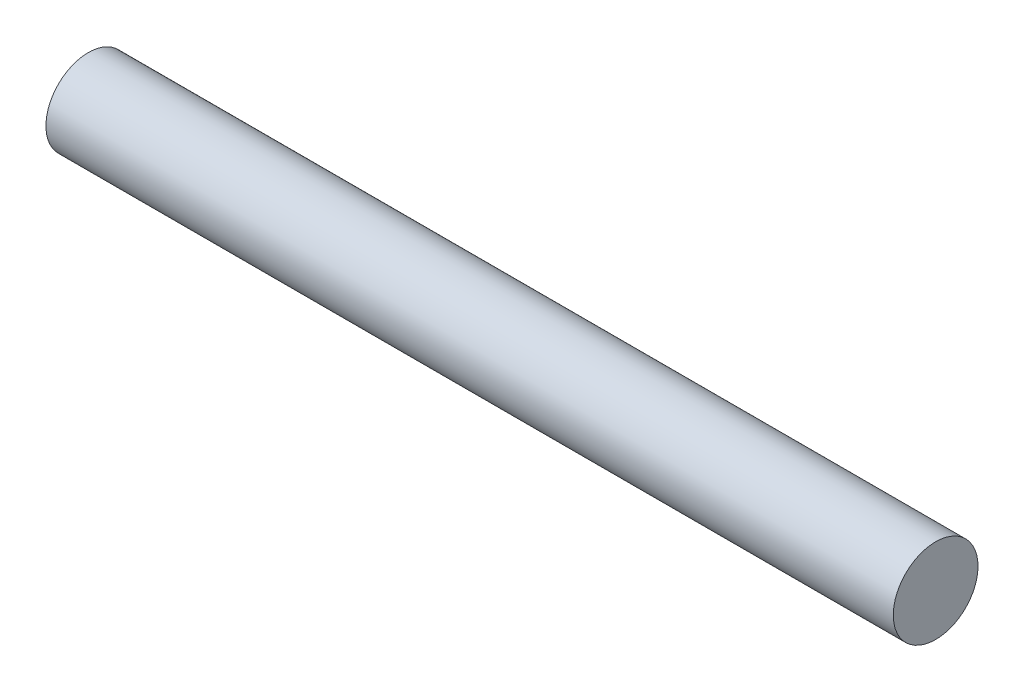
ISO-10303-21;
HEADER;
FILE_DESCRIPTION(('STEP AP214'),'2;1');
FILE_NAME('part.step','',(''),(''),'','','');
FILE_SCHEMA(('AUTOMOTIVE_DESIGN { 1 0 10303 214 1 1 1 1 }'));
ENDSEC;
DATA;
#1=APPLICATION_CONTEXT('core data for automotive mechanical design processes');
#2=APPLICATION_PROTOCOL_DEFINITION('international standard','automotive_design',2000,#1);
#3=PRODUCT_CONTEXT('',#1,'mechanical');
#4=PRODUCT('Part','Part','',(#3));
#5=PRODUCT_RELATED_PRODUCT_CATEGORY('part','',(#4));
#6=PRODUCT_DEFINITION_FORMATION('','',#4);
#7=PRODUCT_DEFINITION_CONTEXT('part definition',#1,'design');
#8=PRODUCT_DEFINITION('design','',#6,#7);
#9=PRODUCT_DEFINITION_SHAPE('','',#8);
#10=(LENGTH_UNIT() NAMED_UNIT(*) SI_UNIT(.MILLI.,.METRE.));
#11=(NAMED_UNIT(*) PLANE_ANGLE_UNIT() SI_UNIT($,.RADIAN.));
#12=(NAMED_UNIT(*) SI_UNIT($,.STERADIAN.) SOLID_ANGLE_UNIT());
#13=UNCERTAINTY_MEASURE_WITH_UNIT(LENGTH_MEASURE(1.E-05),#10,'distance_accuracy_value','');
#14=(GEOMETRIC_REPRESENTATION_CONTEXT(3) GLOBAL_UNCERTAINTY_ASSIGNED_CONTEXT((#13)) GLOBAL_UNIT_ASSIGNED_CONTEXT((#10,
#11,#12)) REPRESENTATION_CONTEXT('',''));
#15=CARTESIAN_POINT('',(0.,0.,0.));
#16=DIRECTION('',(0.,0.,1.));
#17=DIRECTION('',(1.,0.,0.));
#18=AXIS2_PLACEMENT_3D('',#15,#16,#17);
#19=CARTESIAN_POINT('',(15.,0.,0.));
#20=DIRECTION('',(-1.,0.,0.));
#21=DIRECTION('',(0.,0.,1.));
#22=AXIS2_PLACEMENT_3D('',#19,#20,#21);
#23=CYLINDRICAL_SURFACE('',#22,0.75);
#24=CARTESIAN_POINT('',(15.,0.,0.));
#25=DIRECTION('',(1.,0.,0.));
#26=DIRECTION('',(0.,0.,-1.));
#27=AXIS2_PLACEMENT_3D('',#24,#25,#26);
#28=CIRCLE('',#27,0.75);
#29=CARTESIAN_POINT('',(15.,0.,-0.75));
#30=VERTEX_POINT('',#29);
#31=EDGE_CURVE('E12',#30,#30,#28,.T.);
#32=ORIENTED_EDGE('',*,*,#31,.F.);
#33=EDGE_LOOP('',(#32));
#34=FACE_BOUND('',#33,.T.);
#35=CARTESIAN_POINT('',(0.,0.,0.));
#36=DIRECTION('',(1.,0.,0.));
#37=DIRECTION('',(0.,0.,-1.));
#38=AXIS2_PLACEMENT_3D('',#35,#36,#37);
#39=CIRCLE('',#38,0.75);
#40=CARTESIAN_POINT('',(0.,0.,-0.75));
#41=VERTEX_POINT('',#40);
#42=EDGE_CURVE('E45',#41,#41,#39,.T.);
#43=ORIENTED_EDGE('',*,*,#42,.T.);
#44=EDGE_LOOP('',(#43));
#45=FACE_BOUND('',#44,.T.);
#46=ADVANCED_FACE('F42',(#34,#45),#23,.T.);
#47=CARTESIAN_POINT('',(15.,0.,0.));
#48=DIRECTION('',(1.,0.,0.));
#49=DIRECTION('',(0.,0.,-1.));
#50=AXIS2_PLACEMENT_3D('',#47,#48,#49);
#51=PLANE('',#50);
#52=ORIENTED_EDGE('',*,*,#31,.T.);
#53=EDGE_LOOP('',(#52));
#54=FACE_BOUND('',#53,.T.);
#55=ADVANCED_FACE('F57',(#54),#51,.T.);
#56=CARTESIAN_POINT('',(0.,0.,0.));
#57=DIRECTION('',(1.,0.,0.));
#58=DIRECTION('',(0.,0.,-1.));
#59=AXIS2_PLACEMENT_3D('',#56,#57,#58);
#60=PLANE('',#59);
#61=ORIENTED_EDGE('',*,*,#42,.F.);
#62=EDGE_LOOP('',(#61));
#63=FACE_BOUND('',#62,.T.);
#64=ADVANCED_FACE('F55',(#63),#60,.F.);
#65=CLOSED_SHELL('',(#46,#55,#64));
#66=MANIFOLD_SOLID_BREP('B2',#65);
#67=ADVANCED_BREP_SHAPE_REPRESENTATION('',(#18,#66),#14);
#68=SHAPE_DEFINITION_REPRESENTATION(#9,#67);
ENDSEC;
END-ISO-10303-21;
